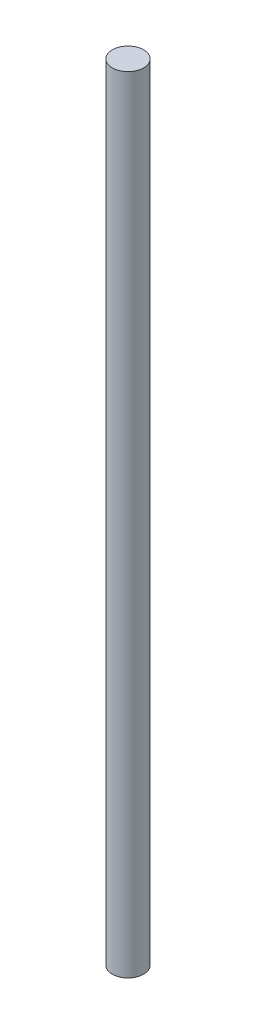
ISO-10303-21;
HEADER;
FILE_DESCRIPTION(('STEP AP214'),'2;1');
FILE_NAME('part.step','',(''),(''),'','','');
FILE_SCHEMA(('AUTOMOTIVE_DESIGN { 1 0 10303 214 1 1 1 1 }'));
ENDSEC;
DATA;
#1=APPLICATION_CONTEXT('core data for automotive mechanical design processes');
#2=APPLICATION_PROTOCOL_DEFINITION('international standard','automotive_design',2000,#1);
#3=PRODUCT_CONTEXT('',#1,'mechanical');
#4=PRODUCT('Part','Part','',(#3));
#5=PRODUCT_RELATED_PRODUCT_CATEGORY('part','',(#4));
#6=PRODUCT_DEFINITION_FORMATION('','',#4);
#7=PRODUCT_DEFINITION_CONTEXT('part definition',#1,'design');
#8=PRODUCT_DEFINITION('design','',#6,#7);
#9=PRODUCT_DEFINITION_SHAPE('','',#8);
#10=(LENGTH_UNIT() NAMED_UNIT(*) SI_UNIT(.MILLI.,.METRE.));
#11=(NAMED_UNIT(*) PLANE_ANGLE_UNIT() SI_UNIT($,.RADIAN.));
#12=(NAMED_UNIT(*) SI_UNIT($,.STERADIAN.) SOLID_ANGLE_UNIT());
#13=UNCERTAINTY_MEASURE_WITH_UNIT(LENGTH_MEASURE(1.E-05),#10,'distance_accuracy_value','');
#14=(GEOMETRIC_REPRESENTATION_CONTEXT(3) GLOBAL_UNCERTAINTY_ASSIGNED_CONTEXT((#13)) GLOBAL_UNIT_ASSIGNED_CONTEXT((#10,
#11,#12)) REPRESENTATION_CONTEXT('',''));
#15=CARTESIAN_POINT('',(0.,0.,0.));
#16=DIRECTION('',(0.,0.,1.));
#17=DIRECTION('',(1.,0.,0.));
#18=AXIS2_PLACEMENT_3D('',#15,#16,#17);
#19=CARTESIAN_POINT('',(0.,10000.,0.));
#20=DIRECTION('',(0.,-1.,0.));
#21=DIRECTION('',(0.,0.,-1.));
#22=AXIS2_PLACEMENT_3D('',#19,#20,#21);
#23=CYLINDRICAL_SURFACE('',#22,200.);
#24=CARTESIAN_POINT('',(0.,10000.,0.));
#25=DIRECTION('',(0.,1.,0.));
#26=DIRECTION('',(0.,0.,1.));
#27=AXIS2_PLACEMENT_3D('',#24,#25,#26);
#28=CIRCLE('',#27,200.);
#29=CARTESIAN_POINT('',(0.,10000.,200.));
#30=VERTEX_POINT('',#29);
#31=EDGE_CURVE('E10',#30,#30,#28,.T.);
#32=ORIENTED_EDGE('',*,*,#31,.F.);
#33=EDGE_LOOP('',(#32));
#34=FACE_BOUND('',#33,.T.);
#35=CARTESIAN_POINT('',(0.,0.,0.));
#36=DIRECTION('',(0.,1.,0.));
#37=DIRECTION('',(0.,0.,1.));
#38=AXIS2_PLACEMENT_3D('',#35,#36,#37);
#39=CIRCLE('',#38,200.);
#40=CARTESIAN_POINT('',(0.,0.,200.));
#41=VERTEX_POINT('',#40);
#42=EDGE_CURVE('E37',#41,#41,#39,.T.);
#43=ORIENTED_EDGE('',*,*,#42,.T.);
#44=EDGE_LOOP('',(#43));
#45=FACE_BOUND('',#44,.T.);
#46=ADVANCED_FACE('F34',(#34,#45),#23,.T.);
#47=CARTESIAN_POINT('',(0.,10000.,0.));
#48=DIRECTION('',(0.,1.,0.));
#49=DIRECTION('',(0.,0.,1.));
#50=AXIS2_PLACEMENT_3D('',#47,#48,#49);
#51=PLANE('',#50);
#52=ORIENTED_EDGE('',*,*,#31,.T.);
#53=EDGE_LOOP('',(#52));
#54=FACE_BOUND('',#53,.T.);
#55=ADVANCED_FACE('F49',(#54),#51,.T.);
#56=CARTESIAN_POINT('',(0.,0.,0.));
#57=DIRECTION('',(0.,1.,0.));
#58=DIRECTION('',(0.,0.,1.));
#59=AXIS2_PLACEMENT_3D('',#56,#57,#58);
#60=PLANE('',#59);
#61=ORIENTED_EDGE('',*,*,#42,.F.);
#62=EDGE_LOOP('',(#61));
#63=FACE_BOUND('',#62,.T.);
#64=ADVANCED_FACE('F47',(#63),#60,.F.);
#65=CLOSED_SHELL('',(#46,#55,#64));
#66=MANIFOLD_SOLID_BREP('B2',#65);
#67=ADVANCED_BREP_SHAPE_REPRESENTATION('',(#18,#66),#14);
#68=SHAPE_DEFINITION_REPRESENTATION(#9,#67);
ENDSEC;
END-ISO-10303-21;
